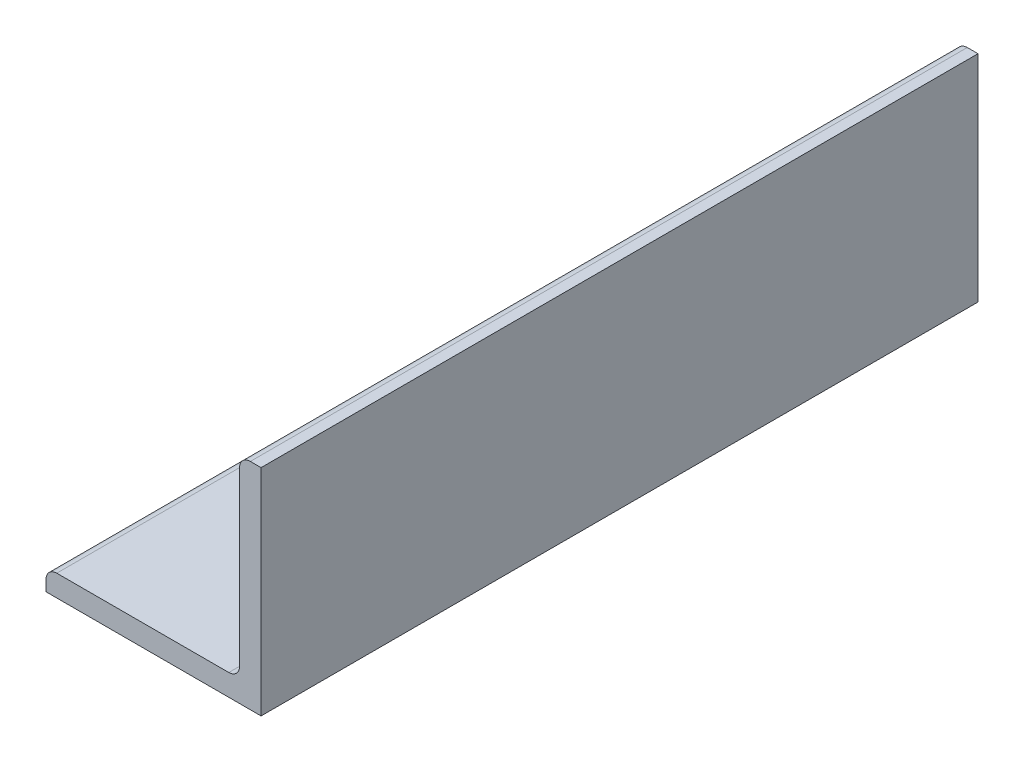
ISO-10303-21;
HEADER;
FILE_DESCRIPTION(('STEP AP214'),'2;1');
FILE_NAME('part.step','',(''),(''),'','','');
FILE_SCHEMA(('AUTOMOTIVE_DESIGN { 1 0 10303 214 1 1 1 1 }'));
ENDSEC;
DATA;
#1=APPLICATION_CONTEXT('core data for automotive mechanical design processes');
#2=APPLICATION_PROTOCOL_DEFINITION('international standard','automotive_design',2000,#1);
#3=PRODUCT_CONTEXT('',#1,'mechanical');
#4=PRODUCT('Part','Part','',(#3));
#5=PRODUCT_RELATED_PRODUCT_CATEGORY('part','',(#4));
#6=PRODUCT_DEFINITION_FORMATION('','',#4);
#7=PRODUCT_DEFINITION_CONTEXT('part definition',#1,'design');
#8=PRODUCT_DEFINITION('design','',#6,#7);
#9=PRODUCT_DEFINITION_SHAPE('','',#8);
#10=(LENGTH_UNIT() NAMED_UNIT(*) SI_UNIT(.MILLI.,.METRE.));
#11=(NAMED_UNIT(*) PLANE_ANGLE_UNIT() SI_UNIT($,.RADIAN.));
#12=(NAMED_UNIT(*) SI_UNIT($,.STERADIAN.) SOLID_ANGLE_UNIT());
#13=UNCERTAINTY_MEASURE_WITH_UNIT(LENGTH_MEASURE(1.E-05),#10,'distance_accuracy_value','');
#14=(GEOMETRIC_REPRESENTATION_CONTEXT(3) GLOBAL_UNCERTAINTY_ASSIGNED_CONTEXT((#13)) GLOBAL_UNIT_ASSIGNED_CONTEXT((#10,
#11,#12)) REPRESENTATION_CONTEXT('',''));
#15=CARTESIAN_POINT('',(0.,0.,0.));
#16=DIRECTION('',(0.,0.,1.));
#17=DIRECTION('',(1.,0.,0.));
#18=AXIS2_PLACEMENT_3D('',#15,#16,#17);
#19=CARTESIAN_POINT('',(-137.100940306666,27.,100.));
#20=DIRECTION('',(0.,-1.,0.));
#21=DIRECTION('',(0.,0.,-1.));
#22=AXIS2_PLACEMENT_3D('',#19,#20,#21);
#23=PLANE('',#22);
#24=DIRECTION('',(-1.,0.,0.));
#25=VECTOR('',#24,1.);
#26=CARTESIAN_POINT('',(-137.100940306666,27.,0.));
#27=LINE('',#26,#25);
#28=CARTESIAN_POINT('',(-135.600940306666,27.,0.));
#29=VERTEX_POINT('',#28);
#30=CARTESIAN_POINT('',(-137.100940306666,27.,0.));
#31=VERTEX_POINT('',#30);
#32=EDGE_CURVE('E135',#29,#31,#27,.T.);
#33=ORIENTED_EDGE('',*,*,#32,.T.);
#34=DIRECTION('',(0.,0.,-1.));
#35=VECTOR('',#34,1.);
#36=CARTESIAN_POINT('',(-137.100940306666,27.,100.));
#37=LINE('',#36,#35);
#38=CARTESIAN_POINT('',(-137.100940306666,27.,100.));
#39=VERTEX_POINT('',#38);
#40=EDGE_CURVE('E11',#39,#31,#37,.T.);
#41=ORIENTED_EDGE('',*,*,#40,.F.);
#42=DIRECTION('',(-1.,0.,0.));
#43=VECTOR('',#42,1.);
#44=CARTESIAN_POINT('',(-137.100940306666,27.,100.));
#45=LINE('',#44,#43);
#46=CARTESIAN_POINT('',(-135.600940306666,27.,100.));
#47=VERTEX_POINT('',#46);
#48=EDGE_CURVE('E151',#47,#39,#45,.T.);
#49=ORIENTED_EDGE('',*,*,#48,.F.);
#50=DIRECTION('',(0.,0.,-1.));
#51=VECTOR('',#50,1.);
#52=CARTESIAN_POINT('',(-135.600940306666,27.,100.));
#53=LINE('',#52,#51);
#54=EDGE_CURVE('E131',#47,#29,#53,.T.);
#55=ORIENTED_EDGE('',*,*,#54,.T.);
#56=EDGE_LOOP('',(#33,#41,#49,#55));
#57=FACE_BOUND('',#56,.T.);
#58=ADVANCED_FACE('F33',(#57),#23,.F.);
#59=CARTESIAN_POINT('',(-137.100940306666,25.5,100.));
#60=DIRECTION('',(0.,0.,-1.));
#61=DIRECTION('',(-1.,0.,0.));
#62=AXIS2_PLACEMENT_3D('',#59,#60,#61);
#63=CYLINDRICAL_SURFACE('',#62,1.5);
#64=CARTESIAN_POINT('',(-137.100940306666,25.5,0.));
#65=DIRECTION('',(0.,0.,1.));
#66=DIRECTION('',(-1.,0.,0.));
#67=AXIS2_PLACEMENT_3D('',#64,#65,#66);
#68=CIRCLE('',#67,1.5);
#69=CARTESIAN_POINT('',(-138.600940306666,25.5,0.));
#70=VERTEX_POINT('',#69);
#71=EDGE_CURVE('E138',#31,#70,#68,.T.);
#72=ORIENTED_EDGE('',*,*,#71,.T.);
#73=DIRECTION('',(0.,0.,-1.));
#74=VECTOR('',#73,1.);
#75=CARTESIAN_POINT('',(-138.600940306666,25.5,100.));
#76=LINE('',#75,#74);
#77=CARTESIAN_POINT('',(-138.600940306666,25.5,100.));
#78=VERTEX_POINT('',#77);
#79=EDGE_CURVE('E41',#78,#70,#76,.T.);
#80=ORIENTED_EDGE('',*,*,#79,.F.);
#81=CARTESIAN_POINT('',(-137.100940306666,25.5,100.));
#82=DIRECTION('',(0.,0.,1.));
#83=DIRECTION('',(-1.,0.,0.));
#84=AXIS2_PLACEMENT_3D('',#81,#82,#83);
#85=CIRCLE('',#84,1.5);
#86=EDGE_CURVE('E95',#39,#78,#85,.T.);
#87=ORIENTED_EDGE('',*,*,#86,.F.);
#88=ORIENTED_EDGE('',*,*,#40,.T.);
#89=EDGE_LOOP('',(#72,#80,#87,#88));
#90=FACE_BOUND('',#89,.T.);
#91=ADVANCED_FACE('F194',(#90),#63,.T.);
#92=CARTESIAN_POINT('',(-138.600940306666,1.50000000000001,100.));
#93=DIRECTION('',(1.,0.,0.));
#94=DIRECTION('',(0.,0.,-1.));
#95=AXIS2_PLACEMENT_3D('',#92,#93,#94);
#96=PLANE('',#95);
#97=DIRECTION('',(0.,-1.,0.));
#98=VECTOR('',#97,1.);
#99=CARTESIAN_POINT('',(-138.600940306666,1.50000000000001,0.));
#100=LINE('',#99,#98);
#101=CARTESIAN_POINT('',(-138.600940306666,1.5,0.));
#102=VERTEX_POINT('',#101);
#103=EDGE_CURVE('E140',#70,#102,#100,.T.);
#104=ORIENTED_EDGE('',*,*,#103,.T.);
#105=DIRECTION('',(0.,0.,-1.));
#106=VECTOR('',#105,1.);
#107=CARTESIAN_POINT('',(-138.600940306666,1.5,100.));
#108=LINE('',#107,#106);
#109=CARTESIAN_POINT('',(-138.600940306666,1.5,100.));
#110=VERTEX_POINT('',#109);
#111=EDGE_CURVE('E161',#110,#102,#108,.T.);
#112=ORIENTED_EDGE('',*,*,#111,.F.);
#113=DIRECTION('',(0.,-1.,0.));
#114=VECTOR('',#113,1.);
#115=CARTESIAN_POINT('',(-138.600940306666,1.50000000000001,100.));
#116=LINE('',#115,#114);
#117=EDGE_CURVE('E169',#78,#110,#116,.T.);
#118=ORIENTED_EDGE('',*,*,#117,.F.);
#119=ORIENTED_EDGE('',*,*,#79,.T.);
#120=EDGE_LOOP('',(#104,#112,#118,#119));
#121=FACE_BOUND('',#120,.T.);
#122=ADVANCED_FACE('F167',(#121),#96,.F.);
#123=CARTESIAN_POINT('',(-140.100940306666,1.5,100.));
#124=DIRECTION('',(0.,0.,-1.));
#125=DIRECTION('',(-1.,0.,0.));
#126=AXIS2_PLACEMENT_3D('',#123,#124,#125);
#127=CYLINDRICAL_SURFACE('',#126,1.5);
#128=CARTESIAN_POINT('',(-140.100940306666,1.5,0.));
#129=DIRECTION('',(0.,0.,-1.));
#130=DIRECTION('',(1.,0.,0.));
#131=AXIS2_PLACEMENT_3D('',#128,#129,#130);
#132=CIRCLE('',#131,1.5);
#133=CARTESIAN_POINT('',(-140.100940306666,0.,0.));
#134=VERTEX_POINT('',#133);
#135=EDGE_CURVE('E142',#102,#134,#132,.T.);
#136=ORIENTED_EDGE('',*,*,#135,.T.);
#137=DIRECTION('',(0.,0.,-1.));
#138=VECTOR('',#137,1.);
#139=CARTESIAN_POINT('',(-140.100940306666,0.,100.));
#140=LINE('',#139,#138);
#141=CARTESIAN_POINT('',(-140.100940306666,0.,100.));
#142=VERTEX_POINT('',#141);
#143=EDGE_CURVE('E158',#142,#134,#140,.T.);
#144=ORIENTED_EDGE('',*,*,#143,.F.);
#145=CARTESIAN_POINT('',(-140.100940306666,1.5,100.));
#146=DIRECTION('',(0.,0.,-1.));
#147=DIRECTION('',(1.,0.,0.));
#148=AXIS2_PLACEMENT_3D('',#145,#146,#147);
#149=CIRCLE('',#148,1.5);
#150=EDGE_CURVE('E185',#110,#142,#149,.T.);
#151=ORIENTED_EDGE('',*,*,#150,.F.);
#152=ORIENTED_EDGE('',*,*,#111,.T.);
#153=EDGE_LOOP('',(#136,#144,#151,#152));
#154=FACE_BOUND('',#153,.T.);
#155=ADVANCED_FACE('F178',(#154),#127,.F.);
#156=CARTESIAN_POINT('',(-164.100940306666,0.,100.));
#157=DIRECTION('',(0.,-1.,0.));
#158=DIRECTION('',(0.,0.,-1.));
#159=AXIS2_PLACEMENT_3D('',#156,#157,#158);
#160=PLANE('',#159);
#161=DIRECTION('',(-1.,0.,0.));
#162=VECTOR('',#161,1.);
#163=CARTESIAN_POINT('',(-164.100940306666,0.,0.));
#164=LINE('',#163,#162);
#165=CARTESIAN_POINT('',(-164.100940306666,0.,0.));
#166=VERTEX_POINT('',#165);
#167=EDGE_CURVE('E144',#134,#166,#164,.T.);
#168=ORIENTED_EDGE('',*,*,#167,.T.);
#169=DIRECTION('',(0.,0.,-1.));
#170=VECTOR('',#169,1.);
#171=CARTESIAN_POINT('',(-164.100940306666,0.,100.));
#172=LINE('',#171,#170);
#173=CARTESIAN_POINT('',(-164.100940306666,0.,100.));
#174=VERTEX_POINT('',#173);
#175=EDGE_CURVE('E155',#174,#166,#172,.T.);
#176=ORIENTED_EDGE('',*,*,#175,.F.);
#177=DIRECTION('',(-1.,0.,0.));
#178=VECTOR('',#177,1.);
#179=CARTESIAN_POINT('',(-164.100940306666,0.,100.));
#180=LINE('',#179,#178);
#181=EDGE_CURVE('E184',#142,#174,#180,.T.);
#182=ORIENTED_EDGE('',*,*,#181,.F.);
#183=ORIENTED_EDGE('',*,*,#143,.T.);
#184=EDGE_LOOP('',(#168,#176,#182,#183));
#185=FACE_BOUND('',#184,.T.);
#186=ADVANCED_FACE('F182',(#185),#160,.F.);
#187=CARTESIAN_POINT('',(-164.100940306666,-1.5,100.));
#188=DIRECTION('',(0.,0.,-1.));
#189=DIRECTION('',(-1.,0.,0.));
#190=AXIS2_PLACEMENT_3D('',#187,#188,#189);
#191=CYLINDRICAL_SURFACE('',#190,1.5);
#192=CARTESIAN_POINT('',(-164.100940306666,-1.5,0.));
#193=DIRECTION('',(0.,0.,1.));
#194=DIRECTION('',(-1.,0.,0.));
#195=AXIS2_PLACEMENT_3D('',#192,#193,#194);
#196=CIRCLE('',#195,1.5);
#197=CARTESIAN_POINT('',(-165.600940306666,-1.50000000000001,0.));
#198=VERTEX_POINT('',#197);
#199=EDGE_CURVE('E146',#166,#198,#196,.T.);
#200=ORIENTED_EDGE('',*,*,#199,.T.);
#201=DIRECTION('',(0.,0.,-1.));
#202=VECTOR('',#201,1.);
#203=CARTESIAN_POINT('',(-165.600940306666,-1.50000000000001,100.));
#204=LINE('',#203,#202);
#205=CARTESIAN_POINT('',(-165.600940306666,-1.50000000000001,100.));
#206=VERTEX_POINT('',#205);
#207=EDGE_CURVE('E126',#206,#198,#204,.T.);
#208=ORIENTED_EDGE('',*,*,#207,.F.);
#209=CARTESIAN_POINT('',(-164.100940306666,-1.5,100.));
#210=DIRECTION('',(0.,0.,1.));
#211=DIRECTION('',(-1.,0.,0.));
#212=AXIS2_PLACEMENT_3D('',#209,#210,#211);
#213=CIRCLE('',#212,1.5);
#214=EDGE_CURVE('E117',#174,#206,#213,.T.);
#215=ORIENTED_EDGE('',*,*,#214,.F.);
#216=ORIENTED_EDGE('',*,*,#175,.T.);
#217=EDGE_LOOP('',(#200,#208,#215,#216));
#218=FACE_BOUND('',#217,.T.);
#219=ADVANCED_FACE('F206',(#218),#191,.T.);
#220=CARTESIAN_POINT('',(-165.600940306666,-3.,100.));
#221=DIRECTION('',(1.,0.,0.));
#222=DIRECTION('',(0.,0.,-1.));
#223=AXIS2_PLACEMENT_3D('',#220,#221,#222);
#224=PLANE('',#223);
#225=DIRECTION('',(0.,-1.,0.));
#226=VECTOR('',#225,1.);
#227=CARTESIAN_POINT('',(-165.600940306666,-3.,0.));
#228=LINE('',#227,#226);
#229=CARTESIAN_POINT('',(-165.600940306666,-3.,0.));
#230=VERTEX_POINT('',#229);
#231=EDGE_CURVE('E125',#198,#230,#228,.T.);
#232=ORIENTED_EDGE('',*,*,#231,.T.);
#233=DIRECTION('',(0.,0.,-1.));
#234=VECTOR('',#233,1.);
#235=CARTESIAN_POINT('',(-165.600940306666,-3.,100.));
#236=LINE('',#235,#234);
#237=CARTESIAN_POINT('',(-165.600940306666,-3.,100.));
#238=VERTEX_POINT('',#237);
#239=EDGE_CURVE('E122',#238,#230,#236,.T.);
#240=ORIENTED_EDGE('',*,*,#239,.F.);
#241=DIRECTION('',(0.,-1.,0.));
#242=VECTOR('',#241,1.);
#243=CARTESIAN_POINT('',(-165.600940306666,-3.,100.));
#244=LINE('',#243,#242);
#245=EDGE_CURVE('E111',#206,#238,#244,.T.);
#246=ORIENTED_EDGE('',*,*,#245,.F.);
#247=ORIENTED_EDGE('',*,*,#207,.T.);
#248=EDGE_LOOP('',(#232,#240,#246,#247));
#249=FACE_BOUND('',#248,.T.);
#250=ADVANCED_FACE('F123',(#249),#224,.F.);
#251=CARTESIAN_POINT('',(-135.600940306666,-3.,100.));
#252=DIRECTION('',(0.,1.,0.));
#253=DIRECTION('',(-1.,0.,0.));
#254=AXIS2_PLACEMENT_3D('',#251,#252,#253);
#255=PLANE('',#254);
#256=DIRECTION('',(1.,0.,0.));
#257=VECTOR('',#256,1.);
#258=CARTESIAN_POINT('',(-135.600940306666,-3.,0.));
#259=LINE('',#258,#257);
#260=CARTESIAN_POINT('',(-135.600940306666,-3.,0.));
#261=VERTEX_POINT('',#260);
#262=EDGE_CURVE('E81',#230,#261,#259,.T.);
#263=ORIENTED_EDGE('',*,*,#262,.T.);
#264=DIRECTION('',(0.,0.,-1.));
#265=VECTOR('',#264,1.);
#266=CARTESIAN_POINT('',(-135.600940306666,-3.,100.));
#267=LINE('',#266,#265);
#268=CARTESIAN_POINT('',(-135.600940306666,-3.,100.));
#269=VERTEX_POINT('',#268);
#270=EDGE_CURVE('E127',#269,#261,#267,.T.);
#271=ORIENTED_EDGE('',*,*,#270,.F.);
#272=DIRECTION('',(1.,0.,0.));
#273=VECTOR('',#272,1.);
#274=CARTESIAN_POINT('',(-135.600940306666,-3.,100.));
#275=LINE('',#274,#273);
#276=EDGE_CURVE('E115',#238,#269,#275,.T.);
#277=ORIENTED_EDGE('',*,*,#276,.F.);
#278=ORIENTED_EDGE('',*,*,#239,.T.);
#279=EDGE_LOOP('',(#263,#271,#277,#278));
#280=FACE_BOUND('',#279,.T.);
#281=ADVANCED_FACE('F129',(#280),#255,.F.);
#282=CARTESIAN_POINT('',(-135.600940306666,27.,100.));
#283=DIRECTION('',(-1.,0.,0.));
#284=DIRECTION('',(0.,0.,1.));
#285=AXIS2_PLACEMENT_3D('',#282,#283,#284);
#286=PLANE('',#285);
#287=DIRECTION('',(0.,1.,0.));
#288=VECTOR('',#287,1.);
#289=CARTESIAN_POINT('',(-135.600940306666,27.,0.));
#290=LINE('',#289,#288);
#291=EDGE_CURVE('E87',#261,#29,#290,.T.);
#292=ORIENTED_EDGE('',*,*,#291,.T.);
#293=ORIENTED_EDGE('',*,*,#54,.F.);
#294=DIRECTION('',(0.,1.,0.));
#295=VECTOR('',#294,1.);
#296=CARTESIAN_POINT('',(-135.600940306666,27.,100.));
#297=LINE('',#296,#295);
#298=EDGE_CURVE('E49',#269,#47,#297,.T.);
#299=ORIENTED_EDGE('',*,*,#298,.F.);
#300=ORIENTED_EDGE('',*,*,#270,.T.);
#301=EDGE_LOOP('',(#292,#293,#299,#300));
#302=FACE_BOUND('',#301,.T.);
#303=ADVANCED_FACE('F214',(#302),#286,.F.);
#304=CARTESIAN_POINT('',(-164.100940306666,-1.5,100.));
#305=DIRECTION('',(0.,0.,-1.));
#306=DIRECTION('',(-1.,0.,0.));
#307=AXIS2_PLACEMENT_3D('',#304,#305,#306);
#308=PLANE('',#307);
#309=ORIENTED_EDGE('',*,*,#48,.T.);
#310=ORIENTED_EDGE('',*,*,#86,.T.);
#311=ORIENTED_EDGE('',*,*,#117,.T.);
#312=ORIENTED_EDGE('',*,*,#150,.T.);
#313=ORIENTED_EDGE('',*,*,#181,.T.);
#314=ORIENTED_EDGE('',*,*,#214,.T.);
#315=ORIENTED_EDGE('',*,*,#245,.T.);
#316=ORIENTED_EDGE('',*,*,#276,.T.);
#317=ORIENTED_EDGE('',*,*,#298,.T.);
#318=EDGE_LOOP('',(#309,#310,#311,#312,#313,#314,#315,#316,#317));
#319=FACE_BOUND('',#318,.T.);
#320=ADVANCED_FACE('F113',(#319),#308,.F.);
#321=CARTESIAN_POINT('',(-164.100940306666,-1.5,0.));
#322=DIRECTION('',(0.,0.,-1.));
#323=DIRECTION('',(-1.,0.,0.));
#324=AXIS2_PLACEMENT_3D('',#321,#322,#323);
#325=PLANE('',#324);
#326=ORIENTED_EDGE('',*,*,#32,.F.);
#327=ORIENTED_EDGE('',*,*,#291,.F.);
#328=ORIENTED_EDGE('',*,*,#262,.F.);
#329=ORIENTED_EDGE('',*,*,#231,.F.);
#330=ORIENTED_EDGE('',*,*,#199,.F.);
#331=ORIENTED_EDGE('',*,*,#167,.F.);
#332=ORIENTED_EDGE('',*,*,#135,.F.);
#333=ORIENTED_EDGE('',*,*,#103,.F.);
#334=ORIENTED_EDGE('',*,*,#71,.F.);
#335=EDGE_LOOP('',(#326,#327,#328,#329,#330,#331,#332,#333,#334));
#336=FACE_BOUND('',#335,.T.);
#337=ADVANCED_FACE('F173',(#336),#325,.T.);
#338=CLOSED_SHELL('',(#58,#91,#122,#155,#186,#219,#250,#281,#303,#320,#337));
#339=MANIFOLD_SOLID_BREP('B2',#338);
#340=ADVANCED_BREP_SHAPE_REPRESENTATION('',(#18,#339),#14);
#341=SHAPE_DEFINITION_REPRESENTATION(#9,#340);
ENDSEC;
END-ISO-10303-21;
